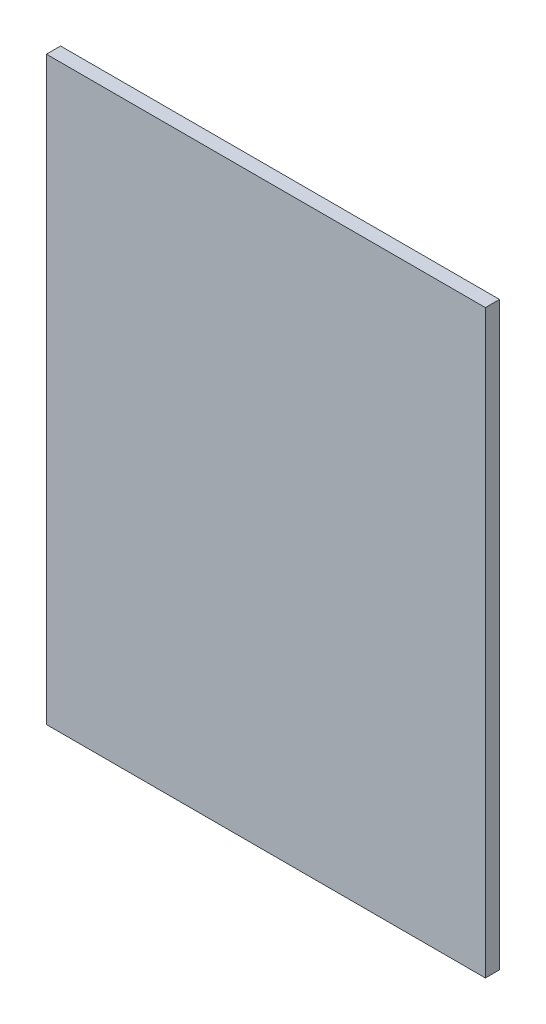
ISO-10303-21;
HEADER;
FILE_DESCRIPTION(('STEP AP214'),'2;1');
FILE_NAME('part.step','',(''),(''),'','','');
FILE_SCHEMA(('AUTOMOTIVE_DESIGN { 1 0 10303 214 1 1 1 1 }'));
ENDSEC;
DATA;
#1=APPLICATION_CONTEXT('core data for automotive mechanical design processes');
#2=APPLICATION_PROTOCOL_DEFINITION('international standard','automotive_design',2000,#1);
#3=PRODUCT_CONTEXT('',#1,'mechanical');
#4=PRODUCT('Part','Part','',(#3));
#5=PRODUCT_RELATED_PRODUCT_CATEGORY('part','',(#4));
#6=PRODUCT_DEFINITION_FORMATION('','',#4);
#7=PRODUCT_DEFINITION_CONTEXT('part definition',#1,'design');
#8=PRODUCT_DEFINITION('design','',#6,#7);
#9=PRODUCT_DEFINITION_SHAPE('','',#8);
#10=(LENGTH_UNIT() NAMED_UNIT(*) SI_UNIT(.MILLI.,.METRE.));
#11=(NAMED_UNIT(*) PLANE_ANGLE_UNIT() SI_UNIT($,.RADIAN.));
#12=(NAMED_UNIT(*) SI_UNIT($,.STERADIAN.) SOLID_ANGLE_UNIT());
#13=UNCERTAINTY_MEASURE_WITH_UNIT(LENGTH_MEASURE(1.E-05),#10,'distance_accuracy_value','');
#14=(GEOMETRIC_REPRESENTATION_CONTEXT(3) GLOBAL_UNCERTAINTY_ASSIGNED_CONTEXT((#13)) GLOBAL_UNIT_ASSIGNED_CONTEXT((#10,
#11,#12)) REPRESENTATION_CONTEXT('',''));
#15=CARTESIAN_POINT('',(0.,0.,0.));
#16=DIRECTION('',(0.,0.,1.));
#17=DIRECTION('',(1.,0.,0.));
#18=AXIS2_PLACEMENT_3D('',#15,#16,#17);
#19=CARTESIAN_POINT('',(0.,0.,10.));
#20=DIRECTION('',(-1.,0.,0.));
#21=DIRECTION('',(0.,0.,1.));
#22=AXIS2_PLACEMENT_3D('',#19,#20,#21);
#23=PLANE('',#22);
#24=DIRECTION('',(0.,1.,0.));
#25=VECTOR('',#24,1.);
#26=CARTESIAN_POINT('',(0.,0.,0.));
#27=LINE('',#26,#25);
#28=CARTESIAN_POINT('',(0.,0.,0.));
#29=VERTEX_POINT('',#28);
#30=CARTESIAN_POINT('',(0.,410.,0.));
#31=VERTEX_POINT('',#30);
#32=EDGE_CURVE('E97',#29,#31,#27,.T.);
#33=ORIENTED_EDGE('',*,*,#32,.T.);
#34=DIRECTION('',(0.,0.,-1.));
#35=VECTOR('',#34,1.);
#36=CARTESIAN_POINT('',(0.,410.,10.));
#37=LINE('',#36,#35);
#38=CARTESIAN_POINT('',(0.,410.,10.));
#39=VERTEX_POINT('',#38);
#40=EDGE_CURVE('E11',#39,#31,#37,.T.);
#41=ORIENTED_EDGE('',*,*,#40,.F.);
#42=DIRECTION('',(0.,1.,0.));
#43=VECTOR('',#42,1.);
#44=CARTESIAN_POINT('',(0.,0.,10.));
#45=LINE('',#44,#43);
#46=CARTESIAN_POINT('',(0.,0.,10.));
#47=VERTEX_POINT('',#46);
#48=EDGE_CURVE('E85',#47,#39,#45,.T.);
#49=ORIENTED_EDGE('',*,*,#48,.F.);
#50=DIRECTION('',(0.,0.,-1.));
#51=VECTOR('',#50,1.);
#52=CARTESIAN_POINT('',(0.,0.,10.));
#53=LINE('',#52,#51);
#54=EDGE_CURVE('E93',#47,#29,#53,.T.);
#55=ORIENTED_EDGE('',*,*,#54,.T.);
#56=EDGE_LOOP('',(#33,#41,#49,#55));
#57=FACE_BOUND('',#56,.T.);
#58=ADVANCED_FACE('F34',(#57),#23,.F.);
#59=CARTESIAN_POINT('',(0.,410.,10.));
#60=DIRECTION('',(0.,-1.,0.));
#61=DIRECTION('',(1.,0.,0.));
#62=AXIS2_PLACEMENT_3D('',#59,#60,#61);
#63=PLANE('',#62);
#64=DIRECTION('',(-1.,0.,0.));
#65=VECTOR('',#64,1.);
#66=CARTESIAN_POINT('',(0.,410.,0.));
#67=LINE('',#66,#65);
#68=CARTESIAN_POINT('',(-310.,410.,0.));
#69=VERTEX_POINT('',#68);
#70=EDGE_CURVE('E89',#31,#69,#67,.T.);
#71=ORIENTED_EDGE('',*,*,#70,.T.);
#72=DIRECTION('',(0.,0.,-1.));
#73=VECTOR('',#72,1.);
#74=CARTESIAN_POINT('',(-310.,410.,10.));
#75=LINE('',#74,#73);
#76=CARTESIAN_POINT('',(-310.,410.,10.));
#77=VERTEX_POINT('',#76);
#78=EDGE_CURVE('E42',#77,#69,#75,.T.);
#79=ORIENTED_EDGE('',*,*,#78,.F.);
#80=DIRECTION('',(-1.,0.,0.));
#81=VECTOR('',#80,1.);
#82=CARTESIAN_POINT('',(0.,410.,10.));
#83=LINE('',#82,#81);
#84=EDGE_CURVE('E80',#39,#77,#83,.T.);
#85=ORIENTED_EDGE('',*,*,#84,.F.);
#86=ORIENTED_EDGE('',*,*,#40,.T.);
#87=EDGE_LOOP('',(#71,#79,#85,#86));
#88=FACE_BOUND('',#87,.T.);
#89=ADVANCED_FACE('F88',(#88),#63,.F.);
#90=CARTESIAN_POINT('',(-310.,0.,10.));
#91=DIRECTION('',(1.,0.,0.));
#92=DIRECTION('',(0.,0.,-1.));
#93=AXIS2_PLACEMENT_3D('',#90,#91,#92);
#94=PLANE('',#93);
#95=DIRECTION('',(0.,-1.,0.));
#96=VECTOR('',#95,1.);
#97=CARTESIAN_POINT('',(-310.,0.,0.));
#98=LINE('',#97,#96);
#99=CARTESIAN_POINT('',(-310.,0.,0.));
#100=VERTEX_POINT('',#99);
#101=EDGE_CURVE('E67',#69,#100,#98,.T.);
#102=ORIENTED_EDGE('',*,*,#101,.T.);
#103=DIRECTION('',(0.,0.,-1.));
#104=VECTOR('',#103,1.);
#105=CARTESIAN_POINT('',(-310.,0.,10.));
#106=LINE('',#105,#104);
#107=CARTESIAN_POINT('',(-310.,0.,10.));
#108=VERTEX_POINT('',#107);
#109=EDGE_CURVE('E90',#108,#100,#106,.T.);
#110=ORIENTED_EDGE('',*,*,#109,.F.);
#111=DIRECTION('',(0.,-1.,0.));
#112=VECTOR('',#111,1.);
#113=CARTESIAN_POINT('',(-310.,0.,10.));
#114=LINE('',#113,#112);
#115=EDGE_CURVE('E83',#77,#108,#114,.T.);
#116=ORIENTED_EDGE('',*,*,#115,.F.);
#117=ORIENTED_EDGE('',*,*,#78,.T.);
#118=EDGE_LOOP('',(#102,#110,#116,#117));
#119=FACE_BOUND('',#118,.T.);
#120=ADVANCED_FACE('F91',(#119),#94,.F.);
#121=CARTESIAN_POINT('',(0.,0.,10.));
#122=DIRECTION('',(0.,1.,0.));
#123=DIRECTION('',(-1.,0.,0.));
#124=AXIS2_PLACEMENT_3D('',#121,#122,#123);
#125=PLANE('',#124);
#126=DIRECTION('',(1.,0.,0.));
#127=VECTOR('',#126,1.);
#128=CARTESIAN_POINT('',(0.,0.,0.));
#129=LINE('',#128,#127);
#130=EDGE_CURVE('E73',#100,#29,#129,.T.);
#131=ORIENTED_EDGE('',*,*,#130,.T.);
#132=ORIENTED_EDGE('',*,*,#54,.F.);
#133=DIRECTION('',(1.,0.,0.));
#134=VECTOR('',#133,1.);
#135=CARTESIAN_POINT('',(0.,0.,10.));
#136=LINE('',#135,#134);
#137=EDGE_CURVE('E50',#108,#47,#136,.T.);
#138=ORIENTED_EDGE('',*,*,#137,.F.);
#139=ORIENTED_EDGE('',*,*,#109,.T.);
#140=EDGE_LOOP('',(#131,#132,#138,#139));
#141=FACE_BOUND('',#140,.T.);
#142=ADVANCED_FACE('F104',(#141),#125,.F.);
#143=CARTESIAN_POINT('',(0.,0.,10.));
#144=DIRECTION('',(0.,0.,1.));
#145=DIRECTION('',(1.,0.,0.));
#146=AXIS2_PLACEMENT_3D('',#143,#144,#145);
#147=PLANE('',#146);
#148=ORIENTED_EDGE('',*,*,#48,.T.);
#149=ORIENTED_EDGE('',*,*,#84,.T.);
#150=ORIENTED_EDGE('',*,*,#115,.T.);
#151=ORIENTED_EDGE('',*,*,#137,.T.);
#152=EDGE_LOOP('',(#148,#149,#150,#151));
#153=FACE_BOUND('',#152,.T.);
#154=ADVANCED_FACE('F81',(#153),#147,.T.);
#155=CARTESIAN_POINT('',(0.,0.,0.));
#156=DIRECTION('',(0.,0.,1.));
#157=DIRECTION('',(1.,0.,0.));
#158=AXIS2_PLACEMENT_3D('',#155,#156,#157);
#159=PLANE('',#158);
#160=ORIENTED_EDGE('',*,*,#32,.F.);
#161=ORIENTED_EDGE('',*,*,#130,.F.);
#162=ORIENTED_EDGE('',*,*,#101,.F.);
#163=ORIENTED_EDGE('',*,*,#70,.F.);
#164=EDGE_LOOP('',(#160,#161,#162,#163));
#165=FACE_BOUND('',#164,.T.);
#166=ADVANCED_FACE('F107',(#165),#159,.F.);
#167=CLOSED_SHELL('',(#58,#89,#120,#142,#154,#166));
#168=MANIFOLD_SOLID_BREP('B2',#167);
#169=ADVANCED_BREP_SHAPE_REPRESENTATION('',(#18,#168),#14);
#170=SHAPE_DEFINITION_REPRESENTATION(#9,#169);
ENDSEC;
END-ISO-10303-21;
